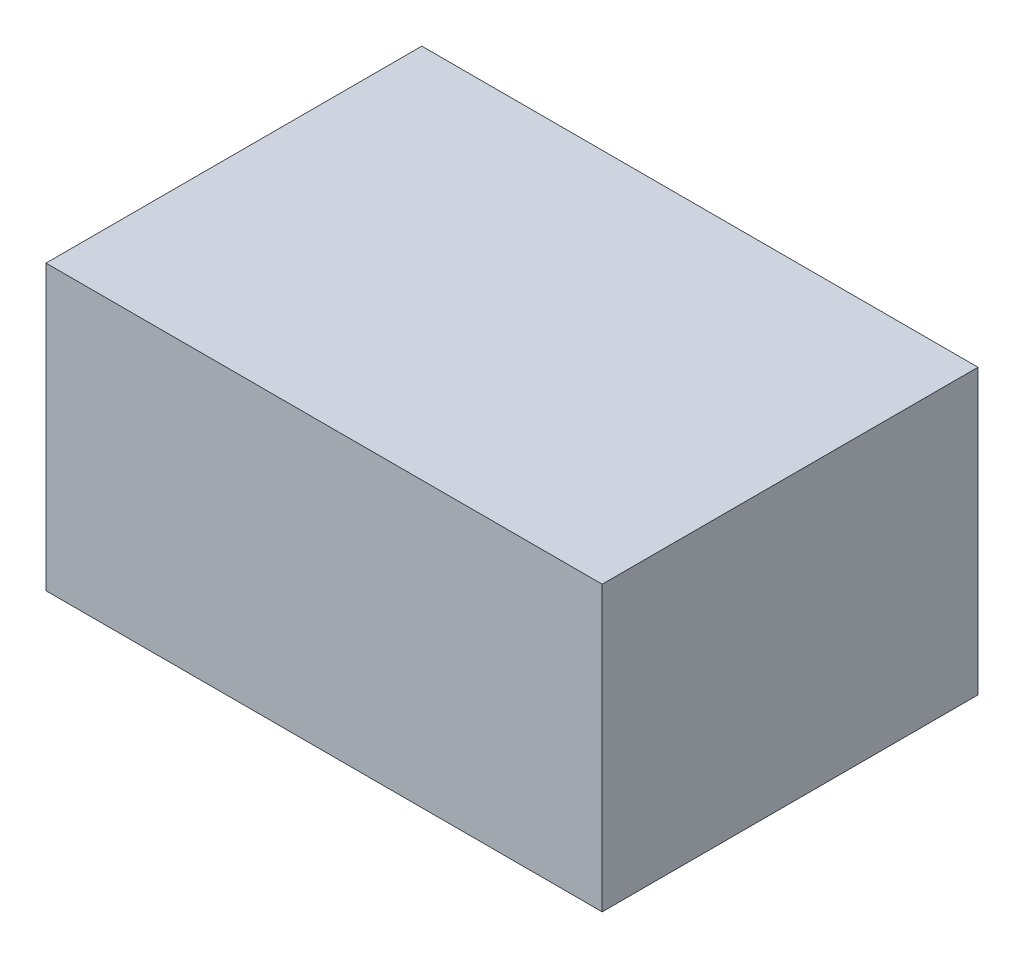
ISO-10303-21;
HEADER;
FILE_DESCRIPTION(('STEP AP214'),'2;1');
FILE_NAME('part.step','',(''),(''),'','','');
FILE_SCHEMA(('AUTOMOTIVE_DESIGN { 1 0 10303 214 1 1 1 1 }'));
ENDSEC;
DATA;
#1=APPLICATION_CONTEXT('core data for automotive mechanical design processes');
#2=APPLICATION_PROTOCOL_DEFINITION('international standard','automotive_design',2000,#1);
#3=PRODUCT_CONTEXT('',#1,'mechanical');
#4=PRODUCT('Part','Part','',(#3));
#5=PRODUCT_RELATED_PRODUCT_CATEGORY('part','',(#4));
#6=PRODUCT_DEFINITION_FORMATION('','',#4);
#7=PRODUCT_DEFINITION_CONTEXT('part definition',#1,'design');
#8=PRODUCT_DEFINITION('design','',#6,#7);
#9=PRODUCT_DEFINITION_SHAPE('','',#8);
#10=(LENGTH_UNIT() NAMED_UNIT(*) SI_UNIT(.MILLI.,.METRE.));
#11=(NAMED_UNIT(*) PLANE_ANGLE_UNIT() SI_UNIT($,.RADIAN.));
#12=(NAMED_UNIT(*) SI_UNIT($,.STERADIAN.) SOLID_ANGLE_UNIT());
#13=UNCERTAINTY_MEASURE_WITH_UNIT(LENGTH_MEASURE(1.E-05),#10,'distance_accuracy_value','');
#14=(GEOMETRIC_REPRESENTATION_CONTEXT(3) GLOBAL_UNCERTAINTY_ASSIGNED_CONTEXT((#13)) GLOBAL_UNIT_ASSIGNED_CONTEXT((#10,
#11,#12)) REPRESENTATION_CONTEXT('',''));
#15=CARTESIAN_POINT('',(0.,0.,0.));
#16=DIRECTION('',(0.,0.,1.));
#17=DIRECTION('',(1.,0.,0.));
#18=AXIS2_PLACEMENT_3D('',#15,#16,#17);
#19=CARTESIAN_POINT('',(-30.4439136621681,50.,-16.6101598097725));
#20=DIRECTION('',(1.,0.,0.));
#21=DIRECTION('',(0.,0.,-1.));
#22=AXIS2_PLACEMENT_3D('',#19,#20,#21);
#23=PLANE('',#22);
#24=DIRECTION('',(0.,0.,1.));
#25=VECTOR('',#24,1.);
#26=CARTESIAN_POINT('',(-30.4439136621681,0.,-16.6101598097725));
#27=LINE('',#26,#25);
#28=CARTESIAN_POINT('',(-30.4439136621681,0.,-16.6101598097725));
#29=VERTEX_POINT('',#28);
#30=CARTESIAN_POINT('',(-30.4439136621681,0.,49.60628397356));
#31=VERTEX_POINT('',#30);
#32=EDGE_CURVE('E96',#29,#31,#27,.T.);
#33=ORIENTED_EDGE('',*,*,#32,.T.);
#34=DIRECTION('',(0.,-1.,0.));
#35=VECTOR('',#34,1.);
#36=CARTESIAN_POINT('',(-30.4439136621681,50.,49.60628397356));
#37=LINE('',#36,#35);
#38=CARTESIAN_POINT('',(-30.4439136621681,50.,49.60628397356));
#39=VERTEX_POINT('',#38);
#40=EDGE_CURVE('E11',#39,#31,#37,.T.);
#41=ORIENTED_EDGE('',*,*,#40,.F.);
#42=DIRECTION('',(0.,0.,1.));
#43=VECTOR('',#42,1.);
#44=CARTESIAN_POINT('',(-30.4439136621681,50.,-16.6101598097725));
#45=LINE('',#44,#43);
#46=CARTESIAN_POINT('',(-30.4439136621681,50.,-16.6101598097725));
#47=VERTEX_POINT('',#46);
#48=EDGE_CURVE('E84',#47,#39,#45,.T.);
#49=ORIENTED_EDGE('',*,*,#48,.F.);
#50=DIRECTION('',(0.,-1.,0.));
#51=VECTOR('',#50,1.);
#52=CARTESIAN_POINT('',(-30.4439136621681,50.,-16.6101598097725));
#53=LINE('',#52,#51);
#54=EDGE_CURVE('E92',#47,#29,#53,.T.);
#55=ORIENTED_EDGE('',*,*,#54,.T.);
#56=EDGE_LOOP('',(#33,#41,#49,#55));
#57=FACE_BOUND('',#56,.T.);
#58=ADVANCED_FACE('F33',(#57),#23,.F.);
#59=CARTESIAN_POINT('',(-30.4439136621681,50.,49.60628397356));
#60=DIRECTION('',(0.,0.,-1.));
#61=DIRECTION('',(-1.,0.,0.));
#62=AXIS2_PLACEMENT_3D('',#59,#60,#61);
#63=PLANE('',#62);
#64=DIRECTION('',(1.,0.,0.));
#65=VECTOR('',#64,1.);
#66=CARTESIAN_POINT('',(-30.4439136621681,0.,49.60628397356));
#67=LINE('',#66,#65);
#68=CARTESIAN_POINT('',(67.5574979248381,0.,49.60628397356));
#69=VERTEX_POINT('',#68);
#70=EDGE_CURVE('E88',#31,#69,#67,.T.);
#71=ORIENTED_EDGE('',*,*,#70,.T.);
#72=DIRECTION('',(0.,-1.,0.));
#73=VECTOR('',#72,1.);
#74=CARTESIAN_POINT('',(67.5574979248381,50.,49.60628397356));
#75=LINE('',#74,#73);
#76=CARTESIAN_POINT('',(67.5574979248381,50.,49.60628397356));
#77=VERTEX_POINT('',#76);
#78=EDGE_CURVE('E41',#77,#69,#75,.T.);
#79=ORIENTED_EDGE('',*,*,#78,.F.);
#80=DIRECTION('',(1.,0.,0.));
#81=VECTOR('',#80,1.);
#82=CARTESIAN_POINT('',(-30.4439136621681,50.,49.60628397356));
#83=LINE('',#82,#81);
#84=EDGE_CURVE('E79',#39,#77,#83,.T.);
#85=ORIENTED_EDGE('',*,*,#84,.F.);
#86=ORIENTED_EDGE('',*,*,#40,.T.);
#87=EDGE_LOOP('',(#71,#79,#85,#86));
#88=FACE_BOUND('',#87,.T.);
#89=ADVANCED_FACE('F87',(#88),#63,.F.);
#90=CARTESIAN_POINT('',(67.5574979248381,50.,-16.6101598097725));
#91=DIRECTION('',(-1.,0.,0.));
#92=DIRECTION('',(0.,0.,1.));
#93=AXIS2_PLACEMENT_3D('',#90,#91,#92);
#94=PLANE('',#93);
#95=DIRECTION('',(0.,0.,-1.));
#96=VECTOR('',#95,1.);
#97=CARTESIAN_POINT('',(67.5574979248381,0.,-16.6101598097725));
#98=LINE('',#97,#96);
#99=CARTESIAN_POINT('',(67.5574979248381,0.,-16.6101598097725));
#100=VERTEX_POINT('',#99);
#101=EDGE_CURVE('E66',#69,#100,#98,.T.);
#102=ORIENTED_EDGE('',*,*,#101,.T.);
#103=DIRECTION('',(0.,-1.,0.));
#104=VECTOR('',#103,1.);
#105=CARTESIAN_POINT('',(67.5574979248381,50.,-16.6101598097725));
#106=LINE('',#105,#104);
#107=CARTESIAN_POINT('',(67.5574979248381,50.,-16.6101598097725));
#108=VERTEX_POINT('',#107);
#109=EDGE_CURVE('E89',#108,#100,#106,.T.);
#110=ORIENTED_EDGE('',*,*,#109,.F.);
#111=DIRECTION('',(0.,0.,-1.));
#112=VECTOR('',#111,1.);
#113=CARTESIAN_POINT('',(67.5574979248381,50.,-16.6101598097725));
#114=LINE('',#113,#112);
#115=EDGE_CURVE('E82',#77,#108,#114,.T.);
#116=ORIENTED_EDGE('',*,*,#115,.F.);
#117=ORIENTED_EDGE('',*,*,#78,.T.);
#118=EDGE_LOOP('',(#102,#110,#116,#117));
#119=FACE_BOUND('',#118,.T.);
#120=ADVANCED_FACE('F90',(#119),#94,.F.);
#121=CARTESIAN_POINT('',(-30.4439136621681,50.,-16.6101598097725));
#122=DIRECTION('',(0.,0.,1.));
#123=DIRECTION('',(1.,0.,0.));
#124=AXIS2_PLACEMENT_3D('',#121,#122,#123);
#125=PLANE('',#124);
#126=DIRECTION('',(-1.,0.,0.));
#127=VECTOR('',#126,1.);
#128=CARTESIAN_POINT('',(-30.4439136621681,0.,-16.6101598097725));
#129=LINE('',#128,#127);
#130=EDGE_CURVE('E72',#100,#29,#129,.T.);
#131=ORIENTED_EDGE('',*,*,#130,.T.);
#132=ORIENTED_EDGE('',*,*,#54,.F.);
#133=DIRECTION('',(-1.,0.,0.));
#134=VECTOR('',#133,1.);
#135=CARTESIAN_POINT('',(-30.4439136621681,50.,-16.6101598097725));
#136=LINE('',#135,#134);
#137=EDGE_CURVE('E49',#108,#47,#136,.T.);
#138=ORIENTED_EDGE('',*,*,#137,.F.);
#139=ORIENTED_EDGE('',*,*,#109,.T.);
#140=EDGE_LOOP('',(#131,#132,#138,#139));
#141=FACE_BOUND('',#140,.T.);
#142=ADVANCED_FACE('F103',(#141),#125,.F.);
#143=CARTESIAN_POINT('',(0.,50.,0.));
#144=DIRECTION('',(0.,1.,0.));
#145=DIRECTION('',(0.,0.,1.));
#146=AXIS2_PLACEMENT_3D('',#143,#144,#145);
#147=PLANE('',#146);
#148=ORIENTED_EDGE('',*,*,#48,.T.);
#149=ORIENTED_EDGE('',*,*,#84,.T.);
#150=ORIENTED_EDGE('',*,*,#115,.T.);
#151=ORIENTED_EDGE('',*,*,#137,.T.);
#152=EDGE_LOOP('',(#148,#149,#150,#151));
#153=FACE_BOUND('',#152,.T.);
#154=ADVANCED_FACE('F80',(#153),#147,.T.);
#155=CARTESIAN_POINT('',(0.,0.,0.));
#156=DIRECTION('',(0.,1.,0.));
#157=DIRECTION('',(0.,0.,1.));
#158=AXIS2_PLACEMENT_3D('',#155,#156,#157);
#159=PLANE('',#158);
#160=ORIENTED_EDGE('',*,*,#32,.F.);
#161=ORIENTED_EDGE('',*,*,#130,.F.);
#162=ORIENTED_EDGE('',*,*,#101,.F.);
#163=ORIENTED_EDGE('',*,*,#70,.F.);
#164=EDGE_LOOP('',(#160,#161,#162,#163));
#165=FACE_BOUND('',#164,.T.);
#166=ADVANCED_FACE('F106',(#165),#159,.F.);
#167=CLOSED_SHELL('',(#58,#89,#120,#142,#154,#166));
#168=MANIFOLD_SOLID_BREP('B2',#167);
#169=ADVANCED_BREP_SHAPE_REPRESENTATION('',(#18,#168),#14);
#170=SHAPE_DEFINITION_REPRESENTATION(#9,#169);
ENDSEC;
END-ISO-10303-21;
